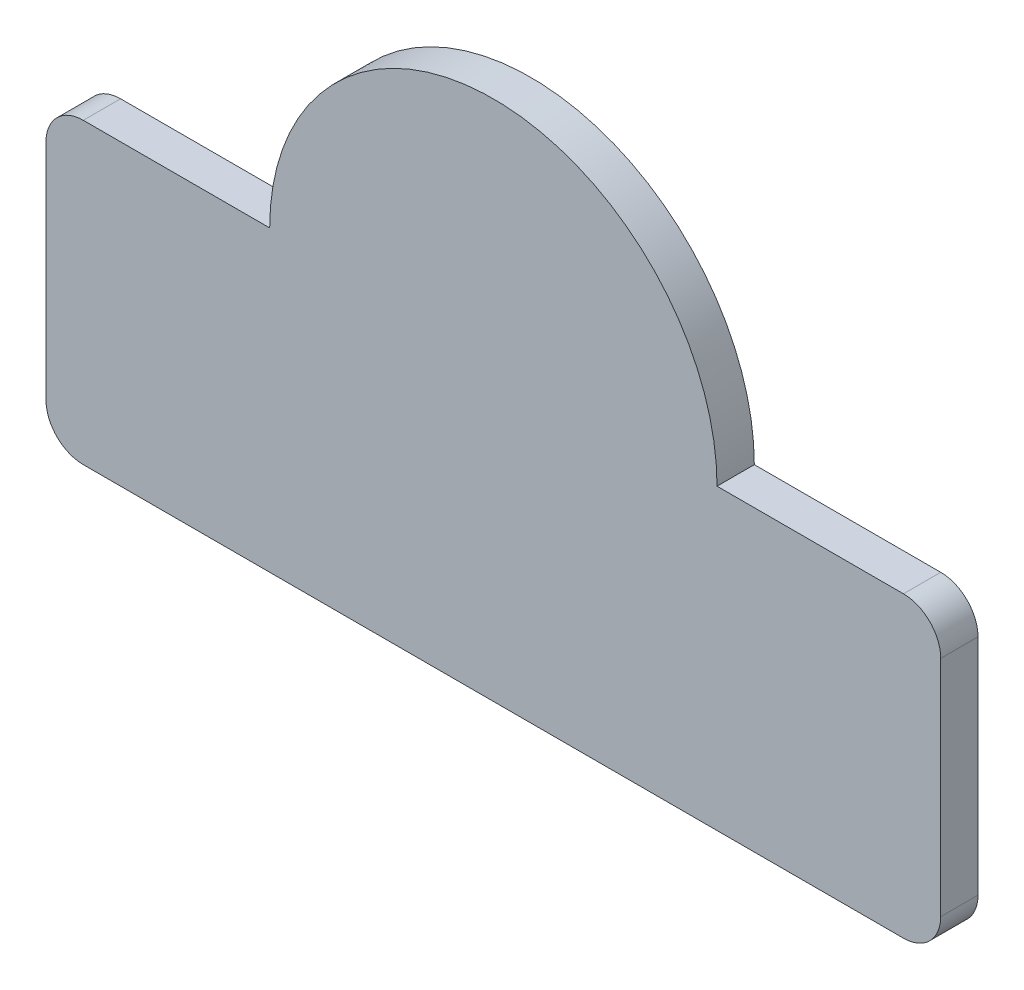
ISO-10303-21;
HEADER;
FILE_DESCRIPTION(('STEP AP214'),'2;1');
FILE_NAME('part.step','',(''),(''),'','','');
FILE_SCHEMA(('AUTOMOTIVE_DESIGN { 1 0 10303 214 1 1 1 1 }'));
ENDSEC;
DATA;
#1=APPLICATION_CONTEXT('core data for automotive mechanical design processes');
#2=APPLICATION_PROTOCOL_DEFINITION('international standard','automotive_design',2000,#1);
#3=PRODUCT_CONTEXT('',#1,'mechanical');
#4=PRODUCT('Part','Part','',(#3));
#5=PRODUCT_RELATED_PRODUCT_CATEGORY('part','',(#4));
#6=PRODUCT_DEFINITION_FORMATION('','',#4);
#7=PRODUCT_DEFINITION_CONTEXT('part definition',#1,'design');
#8=PRODUCT_DEFINITION('design','',#6,#7);
#9=PRODUCT_DEFINITION_SHAPE('','',#8);
#10=(LENGTH_UNIT() NAMED_UNIT(*) SI_UNIT(.MILLI.,.METRE.));
#11=(NAMED_UNIT(*) PLANE_ANGLE_UNIT() SI_UNIT($,.RADIAN.));
#12=(NAMED_UNIT(*) SI_UNIT($,.STERADIAN.) SOLID_ANGLE_UNIT());
#13=UNCERTAINTY_MEASURE_WITH_UNIT(LENGTH_MEASURE(1.E-05),#10,'distance_accuracy_value','');
#14=(GEOMETRIC_REPRESENTATION_CONTEXT(3) GLOBAL_UNCERTAINTY_ASSIGNED_CONTEXT((#13)) GLOBAL_UNIT_ASSIGNED_CONTEXT((#10,
#11,#12)) REPRESENTATION_CONTEXT('',''));
#15=CARTESIAN_POINT('',(0.,0.,0.));
#16=DIRECTION('',(0.,0.,1.));
#17=DIRECTION('',(1.,0.,0.));
#18=AXIS2_PLACEMENT_3D('',#15,#16,#17);
#19=CARTESIAN_POINT('',(16.7353149695587,16.1394582768876,3.175));
#20=DIRECTION('',(0.,0.,-1.));
#21=DIRECTION('',(-1.,0.,0.));
#22=AXIS2_PLACEMENT_3D('',#19,#20,#21);
#23=CYLINDRICAL_SURFACE('',#22,19.05);
#24=CARTESIAN_POINT('',(16.7353149695587,16.1394582768876,0.));
#25=DIRECTION('',(0.,0.,1.));
#26=DIRECTION('',(1.,0.,0.));
#27=AXIS2_PLACEMENT_3D('',#24,#25,#26);
#28=CIRCLE('',#27,19.05);
#29=CARTESIAN_POINT('',(35.7853149695587,16.1394582768876,0.));
#30=VERTEX_POINT('',#29);
#31=CARTESIAN_POINT('',(-2.31468503044133,16.1394582768876,0.));
#32=VERTEX_POINT('',#31);
#33=EDGE_CURVE('E139',#30,#32,#28,.T.);
#34=ORIENTED_EDGE('',*,*,#33,.T.);
#35=DIRECTION('',(0.,0.,-1.));
#36=VECTOR('',#35,1.);
#37=CARTESIAN_POINT('',(-2.31468503044133,16.1394582768876,3.175));
#38=LINE('',#37,#36);
#39=CARTESIAN_POINT('',(-2.31468503044133,16.1394582768876,3.175));
#40=VERTEX_POINT('',#39);
#41=EDGE_CURVE('E121',#40,#32,#38,.T.);
#42=ORIENTED_EDGE('',*,*,#41,.F.);
#43=CARTESIAN_POINT('',(16.7353149695587,16.1394582768876,3.175));
#44=DIRECTION('',(0.,0.,1.));
#45=DIRECTION('',(1.,0.,0.));
#46=AXIS2_PLACEMENT_3D('',#43,#44,#45);
#47=CIRCLE('',#46,19.05);
#48=CARTESIAN_POINT('',(35.7853149695587,16.1394582768876,3.175));
#49=VERTEX_POINT('',#48);
#50=EDGE_CURVE('E126',#49,#40,#47,.T.);
#51=ORIENTED_EDGE('',*,*,#50,.F.);
#52=DIRECTION('',(0.,0.,-1.));
#53=VECTOR('',#52,1.);
#54=CARTESIAN_POINT('',(35.7853149695587,16.1394582768876,3.175));
#55=LINE('',#54,#53);
#56=EDGE_CURVE('E141',#49,#30,#55,.T.);
#57=ORIENTED_EDGE('',*,*,#56,.T.);
#58=EDGE_LOOP('',(#34,#42,#51,#57));
#59=FACE_BOUND('',#58,.T.);
#60=ADVANCED_FACE('F38',(#59),#23,.T.);
#61=CARTESIAN_POINT('',(-21.3646850304413,16.1394582768876,3.175));
#62=DIRECTION('',(0.,-1.,0.));
#63=DIRECTION('',(0.,0.,-1.));
#64=AXIS2_PLACEMENT_3D('',#61,#62,#63);
#65=PLANE('',#64);
#66=DIRECTION('',(-1.,0.,0.));
#67=VECTOR('',#66,1.);
#68=CARTESIAN_POINT('',(-21.3646850304413,16.1394582768876,0.));
#69=LINE('',#68,#67);
#70=CARTESIAN_POINT('',(-18.1896850304413,16.1394582768876,0.));
#71=VERTEX_POINT('',#70);
#72=EDGE_CURVE('E198',#32,#71,#69,.T.);
#73=ORIENTED_EDGE('',*,*,#72,.T.);
#74=DIRECTION('',(0.,0.,-1.));
#75=VECTOR('',#74,1.);
#76=CARTESIAN_POINT('',(-18.1896850304413,16.1394582768876,3.175));
#77=LINE('',#76,#75);
#78=CARTESIAN_POINT('',(-18.1896850304413,16.1394582768876,3.175));
#79=VERTEX_POINT('',#78);
#80=EDGE_CURVE('E11',#71,#79,#77,.F.);
#81=ORIENTED_EDGE('',*,*,#80,.T.);
#82=DIRECTION('',(-1.,0.,0.));
#83=VECTOR('',#82,1.);
#84=CARTESIAN_POINT('',(-21.3646850304413,16.1394582768876,3.175));
#85=LINE('',#84,#83);
#86=EDGE_CURVE('E116',#40,#79,#85,.T.);
#87=ORIENTED_EDGE('',*,*,#86,.F.);
#88=ORIENTED_EDGE('',*,*,#41,.T.);
#89=EDGE_LOOP('',(#73,#81,#87,#88));
#90=FACE_BOUND('',#89,.T.);
#91=ADVANCED_FACE('F119',(#90),#65,.F.);
#92=CARTESIAN_POINT('',(-21.3646850304413,-9.26054172311241,3.175));
#93=DIRECTION('',(1.,0.,0.));
#94=DIRECTION('',(0.,0.,-1.));
#95=AXIS2_PLACEMENT_3D('',#92,#93,#94);
#96=PLANE('',#95);
#97=DIRECTION('',(0.,-1.,0.));
#98=VECTOR('',#97,1.);
#99=CARTESIAN_POINT('',(-21.3646850304413,-9.26054172311241,0.));
#100=LINE('',#99,#98);
#101=CARTESIAN_POINT('',(-21.3646850304413,12.9644582768876,0.));
#102=VERTEX_POINT('',#101);
#103=CARTESIAN_POINT('',(-21.3646850304413,-6.08554172311241,0.));
#104=VERTEX_POINT('',#103);
#105=EDGE_CURVE('E181',#102,#104,#100,.T.);
#106=ORIENTED_EDGE('',*,*,#105,.T.);
#107=DIRECTION('',(0.,0.,-1.));
#108=VECTOR('',#107,1.);
#109=CARTESIAN_POINT('',(-21.3646850304413,-6.08554172311241,3.175));
#110=LINE('',#109,#108);
#111=CARTESIAN_POINT('',(-21.3646850304413,-6.08554172311241,3.175));
#112=VERTEX_POINT('',#111);
#113=EDGE_CURVE('E46',#104,#112,#110,.F.);
#114=ORIENTED_EDGE('',*,*,#113,.T.);
#115=DIRECTION('',(0.,-1.,0.));
#116=VECTOR('',#115,1.);
#117=CARTESIAN_POINT('',(-21.3646850304413,-9.26054172311241,3.175));
#118=LINE('',#117,#116);
#119=CARTESIAN_POINT('',(-21.3646850304413,12.9644582768876,3.175));
#120=VERTEX_POINT('',#119);
#121=EDGE_CURVE('E125',#120,#112,#118,.T.);
#122=ORIENTED_EDGE('',*,*,#121,.F.);
#123=DIRECTION('',(0.,0.,-1.));
#124=VECTOR('',#123,1.);
#125=CARTESIAN_POINT('',(-21.3646850304413,12.9644582768876,3.175));
#126=LINE('',#125,#124);
#127=EDGE_CURVE('E172',#120,#102,#126,.T.);
#128=ORIENTED_EDGE('',*,*,#127,.T.);
#129=EDGE_LOOP('',(#106,#114,#122,#128));
#130=FACE_BOUND('',#129,.T.);
#131=ADVANCED_FACE('F178',(#130),#96,.F.);
#132=CARTESIAN_POINT('',(-21.3646850304413,-9.26054172311241,3.175));
#133=DIRECTION('',(0.,1.,0.));
#134=DIRECTION('',(0.,0.,1.));
#135=AXIS2_PLACEMENT_3D('',#132,#133,#134);
#136=PLANE('',#135);
#137=DIRECTION('',(1.,0.,0.));
#138=VECTOR('',#137,1.);
#139=CARTESIAN_POINT('',(-21.3646850304413,-9.26054172311241,0.));
#140=LINE('',#139,#138);
#141=CARTESIAN_POINT('',(-18.1896850304413,-9.26054172311241,0.));
#142=VERTEX_POINT('',#141);
#143=CARTESIAN_POINT('',(51.6603149695586,-9.26054172311241,0.));
#144=VERTEX_POINT('',#143);
#145=EDGE_CURVE('E189',#142,#144,#140,.T.);
#146=ORIENTED_EDGE('',*,*,#145,.T.);
#147=DIRECTION('',(0.,0.,-1.));
#148=VECTOR('',#147,1.);
#149=CARTESIAN_POINT('',(51.6603149695587,-9.26054172311241,3.175));
#150=LINE('',#149,#148);
#151=CARTESIAN_POINT('',(51.6603149695586,-9.26054172311241,3.175));
#152=VERTEX_POINT('',#151);
#153=EDGE_CURVE('E53',#144,#152,#150,.F.);
#154=ORIENTED_EDGE('',*,*,#153,.T.);
#155=DIRECTION('',(1.,0.,0.));
#156=VECTOR('',#155,1.);
#157=CARTESIAN_POINT('',(-21.3646850304413,-9.26054172311241,3.175));
#158=LINE('',#157,#156);
#159=CARTESIAN_POINT('',(-18.1896850304413,-9.26054172311241,3.175));
#160=VERTEX_POINT('',#159);
#161=EDGE_CURVE('E183',#160,#152,#158,.T.);
#162=ORIENTED_EDGE('',*,*,#161,.F.);
#163=DIRECTION('',(0.,0.,-1.));
#164=VECTOR('',#163,1.);
#165=CARTESIAN_POINT('',(-18.1896850304413,-9.26054172311241,3.175));
#166=LINE('',#165,#164);
#167=EDGE_CURVE('E168',#160,#142,#166,.T.);
#168=ORIENTED_EDGE('',*,*,#167,.T.);
#169=EDGE_LOOP('',(#146,#154,#162,#168));
#170=FACE_BOUND('',#169,.T.);
#171=ADVANCED_FACE('F188',(#170),#136,.F.);
#172=CARTESIAN_POINT('',(54.8353149695587,-9.26054172311241,3.175));
#173=DIRECTION('',(-1.,0.,0.));
#174=DIRECTION('',(0.,0.,1.));
#175=AXIS2_PLACEMENT_3D('',#172,#173,#174);
#176=PLANE('',#175);
#177=DIRECTION('',(0.,1.,0.));
#178=VECTOR('',#177,1.);
#179=CARTESIAN_POINT('',(54.8353149695587,-9.26054172311241,0.));
#180=LINE('',#179,#178);
#181=CARTESIAN_POINT('',(54.8353149695587,-6.08554172311241,0.));
#182=VERTEX_POINT('',#181);
#183=CARTESIAN_POINT('',(54.8353149695587,12.9644582768876,0.));
#184=VERTEX_POINT('',#183);
#185=EDGE_CURVE('E194',#182,#184,#180,.T.);
#186=ORIENTED_EDGE('',*,*,#185,.T.);
#187=DIRECTION('',(0.,0.,-1.));
#188=VECTOR('',#187,1.);
#189=CARTESIAN_POINT('',(54.8353149695587,12.9644582768876,3.175));
#190=LINE('',#189,#188);
#191=CARTESIAN_POINT('',(54.8353149695587,12.9644582768876,3.175));
#192=VERTEX_POINT('',#191);
#193=EDGE_CURVE('E159',#184,#192,#190,.F.);
#194=ORIENTED_EDGE('',*,*,#193,.T.);
#195=DIRECTION('',(0.,1.,0.));
#196=VECTOR('',#195,1.);
#197=CARTESIAN_POINT('',(54.8353149695587,-9.26054172311241,3.175));
#198=LINE('',#197,#196);
#199=CARTESIAN_POINT('',(54.8353149695587,-6.08554172311241,3.175));
#200=VERTEX_POINT('',#199);
#201=EDGE_CURVE('E207',#200,#192,#198,.T.);
#202=ORIENTED_EDGE('',*,*,#201,.F.);
#203=DIRECTION('',(0.,0.,-1.));
#204=VECTOR('',#203,1.);
#205=CARTESIAN_POINT('',(54.8353149695587,-6.08554172311241,3.175));
#206=LINE('',#205,#204);
#207=EDGE_CURVE('E156',#200,#182,#206,.T.);
#208=ORIENTED_EDGE('',*,*,#207,.T.);
#209=EDGE_LOOP('',(#186,#194,#202,#208));
#210=FACE_BOUND('',#209,.T.);
#211=ADVANCED_FACE('F215',(#210),#176,.F.);
#212=CARTESIAN_POINT('',(35.7853149695587,16.1394582768876,3.175));
#213=DIRECTION('',(0.,-1.,0.));
#214=DIRECTION('',(0.,0.,-1.));
#215=AXIS2_PLACEMENT_3D('',#212,#213,#214);
#216=PLANE('',#215);
#217=DIRECTION('',(-1.,0.,0.));
#218=VECTOR('',#217,1.);
#219=CARTESIAN_POINT('',(35.7853149695587,16.1394582768876,3.175));
#220=LINE('',#219,#218);
#221=CARTESIAN_POINT('',(51.6603149695587,16.1394582768876,3.175));
#222=VERTEX_POINT('',#221);
#223=EDGE_CURVE('E132',#222,#49,#220,.T.);
#224=ORIENTED_EDGE('',*,*,#223,.F.);
#225=DIRECTION('',(0.,0.,-1.));
#226=VECTOR('',#225,1.);
#227=CARTESIAN_POINT('',(51.6603149695587,16.1394582768876,3.175));
#228=LINE('',#227,#226);
#229=CARTESIAN_POINT('',(51.6603149695587,16.1394582768876,0.));
#230=VERTEX_POINT('',#229);
#231=EDGE_CURVE('E140',#222,#230,#228,.T.);
#232=ORIENTED_EDGE('',*,*,#231,.T.);
#233=DIRECTION('',(-1.,0.,0.));
#234=VECTOR('',#233,1.);
#235=CARTESIAN_POINT('',(35.7853149695587,16.1394582768876,0.));
#236=LINE('',#235,#234);
#237=EDGE_CURVE('E136',#230,#30,#236,.T.);
#238=ORIENTED_EDGE('',*,*,#237,.T.);
#239=ORIENTED_EDGE('',*,*,#56,.F.);
#240=EDGE_LOOP('',(#224,#232,#238,#239));
#241=FACE_BOUND('',#240,.T.);
#242=ADVANCED_FACE('F202',(#241),#216,.F.);
#243=CARTESIAN_POINT('',(16.7353149695587,16.1394582768876,3.175));
#244=DIRECTION('',(0.,0.,1.));
#245=DIRECTION('',(1.,0.,0.));
#246=AXIS2_PLACEMENT_3D('',#243,#244,#245);
#247=PLANE('',#246);
#248=ORIENTED_EDGE('',*,*,#201,.T.);
#249=CARTESIAN_POINT('',(51.6603149695587,12.9644582768876,3.175));
#250=DIRECTION('',(0.,0.,1.));
#251=DIRECTION('',(1.,0.,0.));
#252=AXIS2_PLACEMENT_3D('',#249,#250,#251);
#253=CIRCLE('',#252,3.175);
#254=EDGE_CURVE('E166',#192,#222,#253,.T.);
#255=ORIENTED_EDGE('',*,*,#254,.T.);
#256=ORIENTED_EDGE('',*,*,#223,.T.);
#257=ORIENTED_EDGE('',*,*,#50,.T.);
#258=ORIENTED_EDGE('',*,*,#86,.T.);
#259=CARTESIAN_POINT('',(-18.1896850304413,12.9644582768876,3.175));
#260=DIRECTION('',(0.,0.,1.));
#261=DIRECTION('',(1.,0.,0.));
#262=AXIS2_PLACEMENT_3D('',#259,#260,#261);
#263=CIRCLE('',#262,3.175);
#264=EDGE_CURVE('E161',#79,#120,#263,.T.);
#265=ORIENTED_EDGE('',*,*,#264,.T.);
#266=ORIENTED_EDGE('',*,*,#121,.T.);
#267=CARTESIAN_POINT('',(-18.1896850304413,-6.08554172311241,3.175));
#268=DIRECTION('',(0.,0.,1.));
#269=DIRECTION('',(1.,0.,0.));
#270=AXIS2_PLACEMENT_3D('',#267,#268,#269);
#271=CIRCLE('',#270,3.175);
#272=EDGE_CURVE('E60',#112,#160,#271,.T.);
#273=ORIENTED_EDGE('',*,*,#272,.T.);
#274=ORIENTED_EDGE('',*,*,#161,.T.);
#275=CARTESIAN_POINT('',(51.6603149695587,-6.08554172311241,3.175));
#276=DIRECTION('',(0.,0.,1.));
#277=DIRECTION('',(1.,0.,0.));
#278=AXIS2_PLACEMENT_3D('',#275,#276,#277);
#279=CIRCLE('',#278,3.175);
#280=EDGE_CURVE('E164',#152,#200,#279,.T.);
#281=ORIENTED_EDGE('',*,*,#280,.T.);
#282=EDGE_LOOP('',(#248,#255,#256,#257,#258,#265,#266,#273,#274,#281));
#283=FACE_BOUND('',#282,.T.);
#284=ADVANCED_FACE('F130',(#283),#247,.T.);
#285=CARTESIAN_POINT('',(16.7353149695587,16.1394582768876,0.));
#286=DIRECTION('',(0.,0.,1.));
#287=DIRECTION('',(1.,0.,0.));
#288=AXIS2_PLACEMENT_3D('',#285,#286,#287);
#289=PLANE('',#288);
#290=ORIENTED_EDGE('',*,*,#237,.F.);
#291=CARTESIAN_POINT('',(51.6603149695587,12.9644582768876,0.));
#292=DIRECTION('',(0.,0.,1.));
#293=DIRECTION('',(1.,0.,0.));
#294=AXIS2_PLACEMENT_3D('',#291,#292,#293);
#295=CIRCLE('',#294,3.175);
#296=EDGE_CURVE('E154',#230,#184,#295,.F.);
#297=ORIENTED_EDGE('',*,*,#296,.T.);
#298=ORIENTED_EDGE('',*,*,#185,.F.);
#299=CARTESIAN_POINT('',(51.6603149695587,-6.08554172311241,0.));
#300=DIRECTION('',(0.,0.,1.));
#301=DIRECTION('',(1.,0.,0.));
#302=AXIS2_PLACEMENT_3D('',#299,#300,#301);
#303=CIRCLE('',#302,3.175);
#304=EDGE_CURVE('E152',#182,#144,#303,.F.);
#305=ORIENTED_EDGE('',*,*,#304,.T.);
#306=ORIENTED_EDGE('',*,*,#145,.F.);
#307=CARTESIAN_POINT('',(-18.1896850304413,-6.08554172311241,0.));
#308=DIRECTION('',(0.,0.,1.));
#309=DIRECTION('',(1.,0.,0.));
#310=AXIS2_PLACEMENT_3D('',#307,#308,#309);
#311=CIRCLE('',#310,3.175);
#312=EDGE_CURVE('E150',#142,#104,#311,.F.);
#313=ORIENTED_EDGE('',*,*,#312,.T.);
#314=ORIENTED_EDGE('',*,*,#105,.F.);
#315=CARTESIAN_POINT('',(-18.1896850304413,12.9644582768876,0.));
#316=DIRECTION('',(0.,0.,1.));
#317=DIRECTION('',(1.,0.,0.));
#318=AXIS2_PLACEMENT_3D('',#315,#316,#317);
#319=CIRCLE('',#318,3.175);
#320=EDGE_CURVE('E144',#102,#71,#319,.F.);
#321=ORIENTED_EDGE('',*,*,#320,.T.);
#322=ORIENTED_EDGE('',*,*,#72,.F.);
#323=ORIENTED_EDGE('',*,*,#33,.F.);
#324=EDGE_LOOP('',(#290,#297,#298,#305,#306,#313,#314,#321,#322,#323));
#325=FACE_BOUND('',#324,.T.);
#326=ADVANCED_FACE('F192',(#325),#289,.F.);
#327=CARTESIAN_POINT('',(51.6603149695587,12.9644582768876,3.175));
#328=DIRECTION('',(0.,0.,-1.));
#329=DIRECTION('',(-1.,0.,0.));
#330=AXIS2_PLACEMENT_3D('',#327,#328,#329);
#331=CYLINDRICAL_SURFACE('',#330,3.175);
#332=ORIENTED_EDGE('',*,*,#254,.F.);
#333=ORIENTED_EDGE('',*,*,#193,.F.);
#334=ORIENTED_EDGE('',*,*,#296,.F.);
#335=ORIENTED_EDGE('',*,*,#231,.F.);
#336=EDGE_LOOP('',(#332,#333,#334,#335));
#337=FACE_BOUND('',#336,.T.);
#338=ADVANCED_FACE('F219',(#337),#331,.T.);
#339=CARTESIAN_POINT('',(51.6603149695587,-6.08554172311241,3.175));
#340=DIRECTION('',(0.,0.,-1.));
#341=DIRECTION('',(-1.,0.,0.));
#342=AXIS2_PLACEMENT_3D('',#339,#340,#341);
#343=CYLINDRICAL_SURFACE('',#342,3.175);
#344=ORIENTED_EDGE('',*,*,#280,.F.);
#345=ORIENTED_EDGE('',*,*,#153,.F.);
#346=ORIENTED_EDGE('',*,*,#304,.F.);
#347=ORIENTED_EDGE('',*,*,#207,.F.);
#348=EDGE_LOOP('',(#344,#345,#346,#347));
#349=FACE_BOUND('',#348,.T.);
#350=ADVANCED_FACE('F213',(#349),#343,.T.);
#351=CARTESIAN_POINT('',(-18.1896850304413,-6.08554172311241,3.175));
#352=DIRECTION('',(0.,0.,-1.));
#353=DIRECTION('',(-1.,0.,0.));
#354=AXIS2_PLACEMENT_3D('',#351,#352,#353);
#355=CYLINDRICAL_SURFACE('',#354,3.175);
#356=ORIENTED_EDGE('',*,*,#272,.F.);
#357=ORIENTED_EDGE('',*,*,#113,.F.);
#358=ORIENTED_EDGE('',*,*,#312,.F.);
#359=ORIENTED_EDGE('',*,*,#167,.F.);
#360=EDGE_LOOP('',(#356,#357,#358,#359));
#361=FACE_BOUND('',#360,.T.);
#362=ADVANCED_FACE('F186',(#361),#355,.T.);
#363=CARTESIAN_POINT('',(-18.1896850304413,12.9644582768876,3.175));
#364=DIRECTION('',(0.,0.,-1.));
#365=DIRECTION('',(-1.,0.,0.));
#366=AXIS2_PLACEMENT_3D('',#363,#364,#365);
#367=CYLINDRICAL_SURFACE('',#366,3.175);
#368=ORIENTED_EDGE('',*,*,#264,.F.);
#369=ORIENTED_EDGE('',*,*,#80,.F.);
#370=ORIENTED_EDGE('',*,*,#320,.F.);
#371=ORIENTED_EDGE('',*,*,#127,.F.);
#372=EDGE_LOOP('',(#368,#369,#370,#371));
#373=FACE_BOUND('',#372,.T.);
#374=ADVANCED_FACE('F40',(#373),#367,.T.);
#375=CLOSED_SHELL('',(#60,#91,#131,#171,#211,#242,#284,#326,#338,#350,#362,#374));
#376=MANIFOLD_SOLID_BREP('B2',#375);
#377=ADVANCED_BREP_SHAPE_REPRESENTATION('',(#18,#376),#14);
#378=SHAPE_DEFINITION_REPRESENTATION(#9,#377);
ENDSEC;
END-ISO-10303-21;
